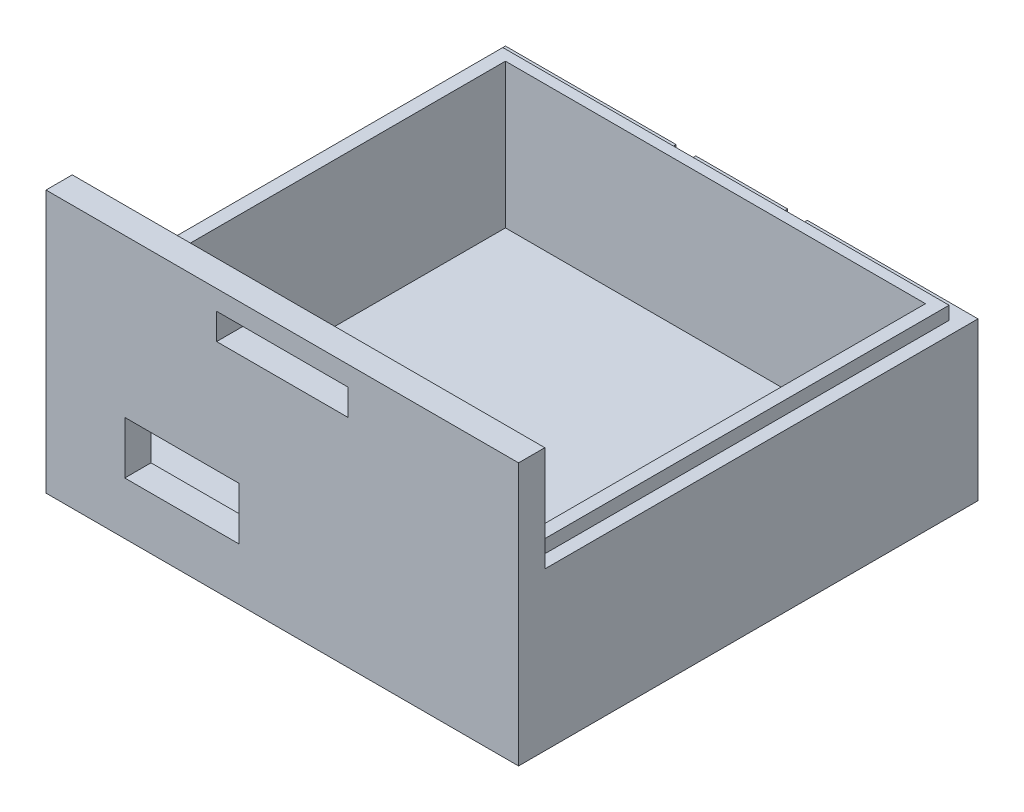
ISO-10303-21;
HEADER;
FILE_DESCRIPTION(('STEP AP214'),'2;1');
FILE_NAME('part.step','',(''),(''),'','','');
FILE_SCHEMA(('AUTOMOTIVE_DESIGN { 1 0 10303 214 1 1 1 1 }'));
ENDSEC;
DATA;
#1=APPLICATION_CONTEXT('core data for automotive mechanical design processes');
#2=APPLICATION_PROTOCOL_DEFINITION('international standard','automotive_design',2000,#1);
#3=PRODUCT_CONTEXT('',#1,'mechanical');
#4=PRODUCT('Part','Part','',(#3));
#5=PRODUCT_RELATED_PRODUCT_CATEGORY('part','',(#4));
#6=PRODUCT_DEFINITION_FORMATION('','',#4);
#7=PRODUCT_DEFINITION_CONTEXT('part definition',#1,'design');
#8=PRODUCT_DEFINITION('design','',#6,#7);
#9=PRODUCT_DEFINITION_SHAPE('','',#8);
#10=(LENGTH_UNIT() NAMED_UNIT(*) SI_UNIT(.MILLI.,.METRE.));
#11=(NAMED_UNIT(*) PLANE_ANGLE_UNIT() SI_UNIT($,.RADIAN.));
#12=(NAMED_UNIT(*) SI_UNIT($,.STERADIAN.) SOLID_ANGLE_UNIT());
#13=UNCERTAINTY_MEASURE_WITH_UNIT(LENGTH_MEASURE(1.E-05),#10,'distance_accuracy_value','');
#14=(GEOMETRIC_REPRESENTATION_CONTEXT(3) GLOBAL_UNCERTAINTY_ASSIGNED_CONTEXT((#13)) GLOBAL_UNIT_ASSIGNED_CONTEXT((#10,
#11,#12)) REPRESENTATION_CONTEXT('',''));
#15=CARTESIAN_POINT('',(0.,0.,0.));
#16=DIRECTION('',(0.,0.,1.));
#17=DIRECTION('',(1.,0.,0.));
#18=AXIS2_PLACEMENT_3D('',#15,#16,#17);
#19=CARTESIAN_POINT('',(-18.,20.,-17.5));
#20=DIRECTION('',(0.,0.,1.));
#21=DIRECTION('',(1.,0.,0.));
#22=AXIS2_PLACEMENT_3D('',#19,#20,#21);
#23=PLANE('',#22);
#24=DIRECTION('',(-1.,0.,0.));
#25=VECTOR('',#24,1.);
#26=CARTESIAN_POINT('',(5.,7.,-17.5));
#27=LINE('',#26,#25);
#28=CARTESIAN_POINT('',(5.,7.,-17.5));
#29=VERTEX_POINT('',#28);
#30=CARTESIAN_POINT('',(-5.,7.,-17.5));
#31=VERTEX_POINT('',#30);
#32=EDGE_CURVE('E532',#29,#31,#27,.T.);
#33=ORIENTED_EDGE('',*,*,#32,.F.);
#34=DIRECTION('',(0.,-1.,0.));
#35=VECTOR('',#34,1.);
#36=CARTESIAN_POINT('',(5.,12.,-17.5));
#37=LINE('',#36,#35);
#38=CARTESIAN_POINT('',(5.,12.,-17.5));
#39=VERTEX_POINT('',#38);
#40=EDGE_CURVE('E259',#39,#29,#37,.T.);
#41=ORIENTED_EDGE('',*,*,#40,.F.);
#42=DIRECTION('',(-1.,0.,0.));
#43=VECTOR('',#42,1.);
#44=CARTESIAN_POINT('',(18.,12.,-17.5));
#45=LINE('',#44,#43);
#46=CARTESIAN_POINT('',(18.,12.,-17.5));
#47=VERTEX_POINT('',#46);
#48=EDGE_CURVE('E322',#47,#39,#45,.T.);
#49=ORIENTED_EDGE('',*,*,#48,.F.);
#50=DIRECTION('',(0.,-1.,0.));
#51=VECTOR('',#50,1.);
#52=CARTESIAN_POINT('',(18.,20.,-17.5));
#53=LINE('',#52,#51);
#54=CARTESIAN_POINT('',(18.,0.,-17.5));
#55=VERTEX_POINT('',#54);
#56=EDGE_CURVE('E11',#47,#55,#53,.T.);
#57=ORIENTED_EDGE('',*,*,#56,.T.);
#58=DIRECTION('',(-1.,0.,0.));
#59=VECTOR('',#58,1.);
#60=CARTESIAN_POINT('',(-18.,0.,-17.5));
#61=LINE('',#60,#59);
#62=CARTESIAN_POINT('',(-18.,0.,-17.5));
#63=VERTEX_POINT('',#62);
#64=EDGE_CURVE('E469',#55,#63,#61,.T.);
#65=ORIENTED_EDGE('',*,*,#64,.T.);
#66=DIRECTION('',(0.,-1.,0.));
#67=VECTOR('',#66,1.);
#68=CARTESIAN_POINT('',(-18.,20.,-17.5));
#69=LINE('',#68,#67);
#70=CARTESIAN_POINT('',(-18.,12.,-17.5));
#71=VERTEX_POINT('',#70);
#72=EDGE_CURVE('E41',#71,#63,#69,.T.);
#73=ORIENTED_EDGE('',*,*,#72,.F.);
#74=CARTESIAN_POINT('',(-5.,12.,-17.5));
#75=VERTEX_POINT('',#74);
#76=EDGE_CURVE('E321',#75,#71,#45,.T.);
#77=ORIENTED_EDGE('',*,*,#76,.F.);
#78=DIRECTION('',(0.,1.,0.));
#79=VECTOR('',#78,1.);
#80=CARTESIAN_POINT('',(-5.,7.,-17.5));
#81=LINE('',#80,#79);
#82=EDGE_CURVE('E529',#31,#75,#81,.T.);
#83=ORIENTED_EDGE('',*,*,#82,.F.);
#84=EDGE_LOOP('',(#33,#41,#49,#57,#65,#73,#77,#83));
#85=FACE_BOUND('',#84,.T.);
#86=ADVANCED_FACE('F33',(#85),#23,.F.);
#87=CARTESIAN_POINT('',(0.,12.,0.));
#88=DIRECTION('',(0.,1.,0.));
#89=DIRECTION('',(0.,0.,1.));
#90=AXIS2_PLACEMENT_3D('',#87,#88,#89);
#91=PLANE('',#90);
#92=DIRECTION('',(0.,0.,-1.));
#93=VECTOR('',#92,1.);
#94=CARTESIAN_POINT('',(-5.,12.,-5.11966011250104));
#95=LINE('',#94,#93);
#96=CARTESIAN_POINT('',(-5.,12.,-16.3));
#97=VERTEX_POINT('',#96);
#98=EDGE_CURVE('E287',#97,#75,#95,.T.);
#99=ORIENTED_EDGE('',*,*,#98,.T.);
#100=ORIENTED_EDGE('',*,*,#76,.T.);
#101=DIRECTION('',(0.,0.,1.));
#102=VECTOR('',#101,1.);
#103=CARTESIAN_POINT('',(-18.,12.,-17.5));
#104=LINE('',#103,#102);
#105=CARTESIAN_POINT('',(-18.,12.,15.5));
#106=VERTEX_POINT('',#105);
#107=EDGE_CURVE('E299',#71,#106,#104,.T.);
#108=ORIENTED_EDGE('',*,*,#107,.T.);
#109=DIRECTION('',(1.,0.,0.));
#110=VECTOR('',#109,1.);
#111=CARTESIAN_POINT('',(-18.,12.,15.5));
#112=LINE('',#111,#110);
#113=CARTESIAN_POINT('',(-17.,12.,15.5));
#114=VERTEX_POINT('',#113);
#115=EDGE_CURVE('E302',#106,#114,#112,.T.);
#116=ORIENTED_EDGE('',*,*,#115,.T.);
#117=DIRECTION('',(0.,0.,-1.));
#118=VECTOR('',#117,1.);
#119=CARTESIAN_POINT('',(-17.,12.,15.5));
#120=LINE('',#119,#118);
#121=CARTESIAN_POINT('',(-17.,12.,-16.3));
#122=VERTEX_POINT('',#121);
#123=EDGE_CURVE('E306',#114,#122,#120,.T.);
#124=ORIENTED_EDGE('',*,*,#123,.T.);
#125=DIRECTION('',(1.,0.,0.));
#126=VECTOR('',#125,1.);
#127=CARTESIAN_POINT('',(-17.,12.,-16.3));
#128=LINE('',#127,#126);
#129=EDGE_CURVE('E309',#122,#97,#128,.T.);
#130=ORIENTED_EDGE('',*,*,#129,.T.);
#131=EDGE_LOOP('',(#99,#100,#108,#116,#124,#130));
#132=FACE_BOUND('',#131,.T.);
#133=ADVANCED_FACE('F511',(#132),#91,.T.);
#134=DIRECTION('',(0.,0.,-1.));
#135=VECTOR('',#134,1.);
#136=CARTESIAN_POINT('',(5.,12.,-5.11966011250104));
#137=LINE('',#136,#135);
#138=CARTESIAN_POINT('',(5.,12.,-16.3));
#139=VERTEX_POINT('',#138);
#140=EDGE_CURVE('E290',#139,#39,#137,.T.);
#141=ORIENTED_EDGE('',*,*,#140,.F.);
#142=CARTESIAN_POINT('',(17.,12.,-16.3));
#143=VERTEX_POINT('',#142);
#144=EDGE_CURVE('E266',#139,#143,#128,.T.);
#145=ORIENTED_EDGE('',*,*,#144,.T.);
#146=DIRECTION('',(0.,0.,1.));
#147=VECTOR('',#146,1.);
#148=CARTESIAN_POINT('',(17.,12.,-16.3));
#149=LINE('',#148,#147);
#150=CARTESIAN_POINT('',(17.,12.,15.5));
#151=VERTEX_POINT('',#150);
#152=EDGE_CURVE('E312',#143,#151,#149,.T.);
#153=ORIENTED_EDGE('',*,*,#152,.T.);
#154=DIRECTION('',(1.,0.,0.));
#155=VECTOR('',#154,1.);
#156=CARTESIAN_POINT('',(17.,12.,15.5));
#157=LINE('',#156,#155);
#158=CARTESIAN_POINT('',(18.,12.,15.5));
#159=VERTEX_POINT('',#158);
#160=EDGE_CURVE('E316',#151,#159,#157,.T.);
#161=ORIENTED_EDGE('',*,*,#160,.T.);
#162=DIRECTION('',(0.,0.,-1.));
#163=VECTOR('',#162,1.);
#164=CARTESIAN_POINT('',(18.,12.,15.5));
#165=LINE('',#164,#163);
#166=EDGE_CURVE('E319',#159,#47,#165,.T.);
#167=ORIENTED_EDGE('',*,*,#166,.T.);
#168=ORIENTED_EDGE('',*,*,#48,.T.);
#169=EDGE_LOOP('',(#141,#145,#153,#161,#167,#168));
#170=FACE_BOUND('',#169,.T.);
#171=ADVANCED_FACE('F552',(#170),#91,.T.);
#172=DIRECTION('',(1.,0.,0.));
#173=VECTOR('',#172,1.);
#174=CARTESIAN_POINT('',(-3.5,9.,-17.5));
#175=LINE('',#174,#173);
#176=CARTESIAN_POINT('',(-3.5,9.,-17.5));
#177=VERTEX_POINT('',#176);
#178=CARTESIAN_POINT('',(3.5,9.,-17.5));
#179=VERTEX_POINT('',#178);
#180=EDGE_CURVE('E268',#177,#179,#175,.T.);
#181=ORIENTED_EDGE('',*,*,#180,.F.);
#182=DIRECTION('',(0.,-1.,0.));
#183=VECTOR('',#182,1.);
#184=CARTESIAN_POINT('',(-3.5,12.,-17.5));
#185=LINE('',#184,#183);
#186=CARTESIAN_POINT('',(-3.5,12.,-17.5));
#187=VERTEX_POINT('',#186);
#188=EDGE_CURVE('E525',#187,#177,#185,.T.);
#189=ORIENTED_EDGE('',*,*,#188,.F.);
#190=CARTESIAN_POINT('',(3.5,12.,-17.5));
#191=VERTEX_POINT('',#190);
#192=EDGE_CURVE('E326',#191,#187,#45,.T.);
#193=ORIENTED_EDGE('',*,*,#192,.F.);
#194=DIRECTION('',(0.,1.,0.));
#195=VECTOR('',#194,1.);
#196=CARTESIAN_POINT('',(3.5,9.,-17.5));
#197=LINE('',#196,#195);
#198=EDGE_CURVE('E48',#179,#191,#197,.T.);
#199=ORIENTED_EDGE('',*,*,#198,.F.);
#200=EDGE_LOOP('',(#181,#189,#193,#199));
#201=FACE_BOUND('',#200,.T.);
#202=ADVANCED_FACE('F523',(#201),#23,.F.);
#203=CARTESIAN_POINT('',(-5.00000000000001,17.5,-17.501));
#204=DIRECTION('',(0.,1.,0.));
#205=DIRECTION('',(0.,0.,1.));
#206=AXIS2_PLACEMENT_3D('',#203,#204,#205);
#207=PLANE('',#206);
#208=DIRECTION('',(1.,0.,0.));
#209=VECTOR('',#208,1.);
#210=CARTESIAN_POINT('',(-4.99999999999999,17.5,16.5));
#211=LINE('',#210,#209);
#212=CARTESIAN_POINT('',(-5.00000000000001,17.5,16.5));
#213=VERTEX_POINT('',#212);
#214=CARTESIAN_POINT('',(4.99999999999999,17.5,16.5));
#215=VERTEX_POINT('',#214);
#216=EDGE_CURVE('E347',#213,#215,#211,.T.);
#217=ORIENTED_EDGE('',*,*,#216,.F.);
#218=DIRECTION('',(0.,0.,1.));
#219=VECTOR('',#218,1.);
#220=CARTESIAN_POINT('',(-5.00000000000001,17.5,-17.501));
#221=LINE('',#220,#219);
#222=CARTESIAN_POINT('',(-5.00000000000001,17.5,15.5));
#223=VERTEX_POINT('',#222);
#224=EDGE_CURVE('E379',#223,#213,#221,.T.);
#225=ORIENTED_EDGE('',*,*,#224,.F.);
#226=DIRECTION('',(1.,0.,0.));
#227=VECTOR('',#226,1.);
#228=CARTESIAN_POINT('',(-5.00000000000001,17.5,15.5));
#229=LINE('',#228,#227);
#230=CARTESIAN_POINT('',(4.99999999999999,17.5,15.5));
#231=VERTEX_POINT('',#230);
#232=EDGE_CURVE('E376',#223,#231,#229,.T.);
#233=ORIENTED_EDGE('',*,*,#232,.T.);
#234=DIRECTION('',(0.,0.,1.));
#235=VECTOR('',#234,1.);
#236=CARTESIAN_POINT('',(4.99999999999999,17.5,-17.501));
#237=LINE('',#236,#235);
#238=EDGE_CURVE('E373',#231,#215,#237,.T.);
#239=ORIENTED_EDGE('',*,*,#238,.T.);
#240=EDGE_LOOP('',(#217,#225,#233,#239));
#241=FACE_BOUND('',#240,.T.);
#242=ADVANCED_FACE('F574',(#241),#207,.F.);
#243=CARTESIAN_POINT('',(18.,20.,17.5));
#244=DIRECTION('',(-1.,0.,0.));
#245=DIRECTION('',(0.,0.,1.));
#246=AXIS2_PLACEMENT_3D('',#243,#244,#245);
#247=PLANE('',#246);
#248=ORIENTED_EDGE('',*,*,#166,.F.);
#249=DIRECTION('',(0.,1.,0.));
#250=VECTOR('',#249,1.);
#251=CARTESIAN_POINT('',(18.,13.,15.5));
#252=LINE('',#251,#250);
#253=CARTESIAN_POINT('',(18.,20.,15.5));
#254=VERTEX_POINT('',#253);
#255=EDGE_CURVE('E453',#159,#254,#252,.T.);
#256=ORIENTED_EDGE('',*,*,#255,.T.);
#257=DIRECTION('',(0.,0.,-1.));
#258=VECTOR('',#257,1.);
#259=CARTESIAN_POINT('',(18.,20.,17.5));
#260=LINE('',#259,#258);
#261=CARTESIAN_POINT('',(18.,20.,17.5));
#262=VERTEX_POINT('',#261);
#263=EDGE_CURVE('E458',#262,#254,#260,.T.);
#264=ORIENTED_EDGE('',*,*,#263,.F.);
#265=DIRECTION('',(0.,-1.,0.));
#266=VECTOR('',#265,1.);
#267=CARTESIAN_POINT('',(18.,20.,17.5));
#268=LINE('',#267,#266);
#269=CARTESIAN_POINT('',(18.,0.,17.5));
#270=VERTEX_POINT('',#269);
#271=EDGE_CURVE('E466',#262,#270,#268,.T.);
#272=ORIENTED_EDGE('',*,*,#271,.T.);
#273=DIRECTION('',(0.,0.,-1.));
#274=VECTOR('',#273,1.);
#275=CARTESIAN_POINT('',(18.,0.,17.5));
#276=LINE('',#275,#274);
#277=EDGE_CURVE('E456',#270,#55,#276,.T.);
#278=ORIENTED_EDGE('',*,*,#277,.T.);
#279=ORIENTED_EDGE('',*,*,#56,.F.);
#280=EDGE_LOOP('',(#248,#256,#264,#272,#278,#279));
#281=FACE_BOUND('',#280,.T.);
#282=ADVANCED_FACE('F35',(#281),#247,.F.);
#283=CARTESIAN_POINT('',(-18.,20.,17.5));
#284=DIRECTION('',(1.,0.,0.));
#285=DIRECTION('',(0.,0.,-1.));
#286=AXIS2_PLACEMENT_3D('',#283,#284,#285);
#287=PLANE('',#286);
#288=DIRECTION('',(0.,1.,0.));
#289=VECTOR('',#288,1.);
#290=CARTESIAN_POINT('',(-18.,13.,15.5));
#291=LINE('',#290,#289);
#292=CARTESIAN_POINT('',(-18.,20.,15.5));
#293=VERTEX_POINT('',#292);
#294=EDGE_CURVE('E450',#106,#293,#291,.T.);
#295=ORIENTED_EDGE('',*,*,#294,.F.);
#296=ORIENTED_EDGE('',*,*,#107,.F.);
#297=ORIENTED_EDGE('',*,*,#72,.T.);
#298=DIRECTION('',(0.,0.,1.));
#299=VECTOR('',#298,1.);
#300=CARTESIAN_POINT('',(-18.,0.,17.5));
#301=LINE('',#300,#299);
#302=CARTESIAN_POINT('',(-18.,0.,17.5));
#303=VERTEX_POINT('',#302);
#304=EDGE_CURVE('E472',#63,#303,#301,.T.);
#305=ORIENTED_EDGE('',*,*,#304,.T.);
#306=DIRECTION('',(0.,-1.,0.));
#307=VECTOR('',#306,1.);
#308=CARTESIAN_POINT('',(-18.,20.,17.5));
#309=LINE('',#308,#307);
#310=CARTESIAN_POINT('',(-18.,20.,17.5));
#311=VERTEX_POINT('',#310);
#312=EDGE_CURVE('E477',#311,#303,#309,.T.);
#313=ORIENTED_EDGE('',*,*,#312,.F.);
#314=DIRECTION('',(0.,0.,1.));
#315=VECTOR('',#314,1.);
#316=CARTESIAN_POINT('',(-18.,20.,17.5));
#317=LINE('',#316,#315);
#318=EDGE_CURVE('E461',#293,#311,#317,.T.);
#319=ORIENTED_EDGE('',*,*,#318,.F.);
#320=EDGE_LOOP('',(#295,#296,#297,#305,#313,#319));
#321=FACE_BOUND('',#320,.T.);
#322=ADVANCED_FACE('F482',(#321),#287,.F.);
#323=CARTESIAN_POINT('',(-18.,20.,17.5));
#324=DIRECTION('',(0.,0.,-1.));
#325=DIRECTION('',(-1.,0.,0.));
#326=AXIS2_PLACEMENT_3D('',#323,#324,#325);
#327=PLANE('',#326);
#328=DIRECTION('',(-1.,0.,0.));
#329=VECTOR('',#328,1.);
#330=CARTESIAN_POINT('',(-4.99999999999999,18.5,17.5));
#331=LINE('',#330,#329);
#332=CARTESIAN_POINT('',(4.99999999999999,18.5,17.5));
#333=VERTEX_POINT('',#332);
#334=CARTESIAN_POINT('',(-4.99999999999999,18.5,17.5));
#335=VERTEX_POINT('',#334);
#336=EDGE_CURVE('E335',#333,#335,#331,.T.);
#337=ORIENTED_EDGE('',*,*,#336,.F.);
#338=DIRECTION('',(0.,1.,0.));
#339=VECTOR('',#338,1.);
#340=CARTESIAN_POINT('',(4.99999999999999,17.5,17.5));
#341=LINE('',#340,#339);
#342=CARTESIAN_POINT('',(4.99999999999999,16.5,17.5));
#343=VERTEX_POINT('',#342);
#344=EDGE_CURVE('E365',#343,#333,#341,.T.);
#345=ORIENTED_EDGE('',*,*,#344,.F.);
#346=DIRECTION('',(1.,0.,0.));
#347=VECTOR('',#346,1.);
#348=CARTESIAN_POINT('',(-5.00000000000001,16.5,17.5));
#349=LINE('',#348,#347);
#350=CARTESIAN_POINT('',(-5.00000000000001,16.5,17.5));
#351=VERTEX_POINT('',#350);
#352=EDGE_CURVE('E370',#351,#343,#349,.T.);
#353=ORIENTED_EDGE('',*,*,#352,.F.);
#354=DIRECTION('',(0.,-1.,0.));
#355=VECTOR('',#354,1.);
#356=CARTESIAN_POINT('',(-5.00000000000001,17.5,17.5));
#357=LINE('',#356,#355);
#358=EDGE_CURVE('E367',#335,#351,#357,.T.);
#359=ORIENTED_EDGE('',*,*,#358,.F.);
#360=EDGE_LOOP('',(#337,#345,#353,#359));
#361=FACE_BOUND('',#360,.T.);
#362=DIRECTION('',(-1.,0.,0.));
#363=VECTOR('',#362,1.);
#364=CARTESIAN_POINT('',(-12.,8.,17.5));
#365=LINE('',#364,#363);
#366=CARTESIAN_POINT('',(-3.3,8.,17.5));
#367=VERTEX_POINT('',#366);
#368=CARTESIAN_POINT('',(-12.,8.,17.5));
#369=VERTEX_POINT('',#368);
#370=EDGE_CURVE('E396',#367,#369,#365,.T.);
#371=ORIENTED_EDGE('',*,*,#370,.F.);
#372=DIRECTION('',(0.,1.,0.));
#373=VECTOR('',#372,1.);
#374=CARTESIAN_POINT('',(-3.3,4.,17.5));
#375=LINE('',#374,#373);
#376=CARTESIAN_POINT('',(-3.3,4.,17.5));
#377=VERTEX_POINT('',#376);
#378=EDGE_CURVE('E394',#377,#367,#375,.T.);
#379=ORIENTED_EDGE('',*,*,#378,.F.);
#380=DIRECTION('',(1.,0.,0.));
#381=VECTOR('',#380,1.);
#382=CARTESIAN_POINT('',(-12.,4.,17.5));
#383=LINE('',#382,#381);
#384=CARTESIAN_POINT('',(-12.,4.,17.5));
#385=VERTEX_POINT('',#384);
#386=EDGE_CURVE('E402',#385,#377,#383,.T.);
#387=ORIENTED_EDGE('',*,*,#386,.F.);
#388=DIRECTION('',(0.,-1.,0.));
#389=VECTOR('',#388,1.);
#390=CARTESIAN_POINT('',(-12.,4.,17.5));
#391=LINE('',#390,#389);
#392=EDGE_CURVE('E399',#369,#385,#391,.T.);
#393=ORIENTED_EDGE('',*,*,#392,.F.);
#394=EDGE_LOOP('',(#371,#379,#387,#393));
#395=FACE_BOUND('',#394,.T.);
#396=DIRECTION('',(1.,0.,0.));
#397=VECTOR('',#396,1.);
#398=CARTESIAN_POINT('',(-18.,0.,17.5));
#399=LINE('',#398,#397);
#400=EDGE_CURVE('E462',#303,#270,#399,.T.);
#401=ORIENTED_EDGE('',*,*,#400,.T.);
#402=ORIENTED_EDGE('',*,*,#271,.F.);
#403=DIRECTION('',(1.,0.,0.));
#404=VECTOR('',#403,1.);
#405=CARTESIAN_POINT('',(-18.,20.,17.5));
#406=LINE('',#405,#404);
#407=EDGE_CURVE('E464',#311,#262,#406,.T.);
#408=ORIENTED_EDGE('',*,*,#407,.F.);
#409=ORIENTED_EDGE('',*,*,#312,.T.);
#410=EDGE_LOOP('',(#401,#402,#408,#409));
#411=FACE_BOUND('',#410,.T.);
#412=ADVANCED_FACE('F496',(#361,#395,#411),#327,.F.);
#413=CARTESIAN_POINT('',(0.,20.,0.));
#414=DIRECTION('',(0.,-1.,0.));
#415=DIRECTION('',(0.,0.,-1.));
#416=AXIS2_PLACEMENT_3D('',#413,#414,#415);
#417=PLANE('',#416);
#418=ORIENTED_EDGE('',*,*,#263,.T.);
#419=DIRECTION('',(1.,0.,0.));
#420=VECTOR('',#419,1.);
#421=CARTESIAN_POINT('',(-18.,20.,15.5));
#422=LINE('',#421,#420);
#423=EDGE_CURVE('E441',#293,#254,#422,.T.);
#424=ORIENTED_EDGE('',*,*,#423,.F.);
#425=ORIENTED_EDGE('',*,*,#318,.T.);
#426=ORIENTED_EDGE('',*,*,#407,.T.);
#427=EDGE_LOOP('',(#418,#424,#425,#426));
#428=FACE_BOUND('',#427,.T.);
#429=ADVANCED_FACE('F503',(#428),#417,.F.);
#430=CARTESIAN_POINT('',(0.,0.,0.));
#431=DIRECTION('',(0.,-1.,0.));
#432=DIRECTION('',(0.,0.,-1.));
#433=AXIS2_PLACEMENT_3D('',#430,#431,#432);
#434=PLANE('',#433);
#435=ORIENTED_EDGE('',*,*,#277,.F.);
#436=ORIENTED_EDGE('',*,*,#400,.F.);
#437=ORIENTED_EDGE('',*,*,#304,.F.);
#438=ORIENTED_EDGE('',*,*,#64,.F.);
#439=EDGE_LOOP('',(#435,#436,#437,#438));
#440=FACE_BOUND('',#439,.T.);
#441=ADVANCED_FACE('F493',(#440),#434,.T.);
#442=CARTESIAN_POINT('',(-18.,13.,15.5));
#443=DIRECTION('',(0.,0.,1.));
#444=DIRECTION('',(1.,0.,0.));
#445=AXIS2_PLACEMENT_3D('',#442,#443,#444);
#446=PLANE('',#445);
#447=DIRECTION('',(-1.,0.,0.));
#448=VECTOR('',#447,1.);
#449=CARTESIAN_POINT('',(-5.00000000000001,16.5,15.5));
#450=LINE('',#449,#448);
#451=CARTESIAN_POINT('',(4.99999999999999,16.5,15.5));
#452=VERTEX_POINT('',#451);
#453=CARTESIAN_POINT('',(-5.00000000000001,16.5,15.5));
#454=VERTEX_POINT('',#453);
#455=EDGE_CURVE('E359',#452,#454,#450,.T.);
#456=ORIENTED_EDGE('',*,*,#455,.F.);
#457=DIRECTION('',(0.,-1.,0.));
#458=VECTOR('',#457,1.);
#459=CARTESIAN_POINT('',(4.99999999999999,17.5,15.5));
#460=LINE('',#459,#458);
#461=EDGE_CURVE('E362',#231,#452,#460,.T.);
#462=ORIENTED_EDGE('',*,*,#461,.F.);
#463=ORIENTED_EDGE('',*,*,#232,.F.);
#464=DIRECTION('',(0.,1.,0.));
#465=VECTOR('',#464,1.);
#466=CARTESIAN_POINT('',(-5.00000000000001,17.5,15.5));
#467=LINE('',#466,#465);
#468=EDGE_CURVE('E355',#454,#223,#467,.T.);
#469=ORIENTED_EDGE('',*,*,#468,.F.);
#470=EDGE_LOOP('',(#456,#462,#463,#469));
#471=FACE_BOUND('',#470,.T.);
#472=DIRECTION('',(-1.,0.,0.));
#473=VECTOR('',#472,1.);
#474=CARTESIAN_POINT('',(-12.,4.,15.5));
#475=LINE('',#474,#473);
#476=CARTESIAN_POINT('',(-3.3,4.,15.5));
#477=VERTEX_POINT('',#476);
#478=CARTESIAN_POINT('',(-12.,4.,15.5));
#479=VERTEX_POINT('',#478);
#480=EDGE_CURVE('E388',#477,#479,#475,.T.);
#481=ORIENTED_EDGE('',*,*,#480,.F.);
#482=DIRECTION('',(0.,-1.,0.));
#483=VECTOR('',#482,1.);
#484=CARTESIAN_POINT('',(-3.3,4.,15.5));
#485=LINE('',#484,#483);
#486=CARTESIAN_POINT('',(-3.3,8.,15.5));
#487=VERTEX_POINT('',#486);
#488=EDGE_CURVE('E391',#487,#477,#485,.T.);
#489=ORIENTED_EDGE('',*,*,#488,.F.);
#490=DIRECTION('',(1.,0.,0.));
#491=VECTOR('',#490,1.);
#492=CARTESIAN_POINT('',(-12.,8.,15.5));
#493=LINE('',#492,#491);
#494=CARTESIAN_POINT('',(-12.,8.,15.5));
#495=VERTEX_POINT('',#494);
#496=EDGE_CURVE('E408',#495,#487,#493,.T.);
#497=ORIENTED_EDGE('',*,*,#496,.F.);
#498=DIRECTION('',(0.,1.,0.));
#499=VECTOR('',#498,1.);
#500=CARTESIAN_POINT('',(-12.,4.,15.5));
#501=LINE('',#500,#499);
#502=EDGE_CURVE('E386',#479,#495,#501,.T.);
#503=ORIENTED_EDGE('',*,*,#502,.F.);
#504=EDGE_LOOP('',(#481,#489,#497,#503));
#505=FACE_BOUND('',#504,.T.);
#506=ORIENTED_EDGE('',*,*,#423,.T.);
#507=ORIENTED_EDGE('',*,*,#255,.F.);
#508=ORIENTED_EDGE('',*,*,#160,.F.);
#509=DIRECTION('',(0.,1.,0.));
#510=VECTOR('',#509,1.);
#511=CARTESIAN_POINT('',(17.,12.,15.5));
#512=LINE('',#511,#510);
#513=CARTESIAN_POINT('',(17.,13.,15.5));
#514=VERTEX_POINT('',#513);
#515=EDGE_CURVE('E333',#151,#514,#512,.T.);
#516=ORIENTED_EDGE('',*,*,#515,.T.);
#517=DIRECTION('',(1.,0.,0.));
#518=VECTOR('',#517,1.);
#519=CARTESIAN_POINT('',(-18.,13.,15.5));
#520=LINE('',#519,#518);
#521=CARTESIAN_POINT('',(16.,13.,15.5));
#522=VERTEX_POINT('',#521);
#523=EDGE_CURVE('E451',#522,#514,#520,.T.);
#524=ORIENTED_EDGE('',*,*,#523,.F.);
#525=DIRECTION('',(0.,1.,0.));
#526=VECTOR('',#525,1.);
#527=CARTESIAN_POINT('',(16.,2.,15.5));
#528=LINE('',#527,#526);
#529=CARTESIAN_POINT('',(16.,2.,15.5));
#530=VERTEX_POINT('',#529);
#531=EDGE_CURVE('E444',#530,#522,#528,.T.);
#532=ORIENTED_EDGE('',*,*,#531,.F.);
#533=DIRECTION('',(1.,0.,0.));
#534=VECTOR('',#533,1.);
#535=CARTESIAN_POINT('',(-16.,2.,15.5));
#536=LINE('',#535,#534);
#537=CARTESIAN_POINT('',(-16.,2.,15.5));
#538=VERTEX_POINT('',#537);
#539=EDGE_CURVE('E421',#538,#530,#536,.T.);
#540=ORIENTED_EDGE('',*,*,#539,.F.);
#541=DIRECTION('',(0.,1.,0.));
#542=VECTOR('',#541,1.);
#543=CARTESIAN_POINT('',(-16.,2.,15.5));
#544=LINE('',#543,#542);
#545=CARTESIAN_POINT('',(-16.,13.,15.5));
#546=VERTEX_POINT('',#545);
#547=EDGE_CURVE('E431',#538,#546,#544,.T.);
#548=ORIENTED_EDGE('',*,*,#547,.T.);
#549=CARTESIAN_POINT('',(-17.,13.,15.5));
#550=VERTEX_POINT('',#549);
#551=EDGE_CURVE('E448',#550,#546,#520,.T.);
#552=ORIENTED_EDGE('',*,*,#551,.F.);
#553=DIRECTION('',(0.,1.,0.));
#554=VECTOR('',#553,1.);
#555=CARTESIAN_POINT('',(-17.,12.,15.5));
#556=LINE('',#555,#554);
#557=EDGE_CURVE('E325',#114,#550,#556,.T.);
#558=ORIENTED_EDGE('',*,*,#557,.F.);
#559=ORIENTED_EDGE('',*,*,#115,.F.);
#560=ORIENTED_EDGE('',*,*,#294,.T.);
#561=EDGE_LOOP('',(#506,#507,#508,#516,#524,#532,#540,#548,#552,#558,#559,#560));
#562=FACE_BOUND('',#561,.T.);
#563=ADVANCED_FACE('F507',(#471,#505,#562),#446,.F.);
#564=CARTESIAN_POINT('',(0.,13.,0.));
#565=DIRECTION('',(0.,1.,0.));
#566=DIRECTION('',(0.,0.,1.));
#567=AXIS2_PLACEMENT_3D('',#564,#565,#566);
#568=PLANE('',#567);
#569=DIRECTION('',(0.,0.,1.));
#570=VECTOR('',#569,1.);
#571=CARTESIAN_POINT('',(17.,13.,-16.3));
#572=LINE('',#571,#570);
#573=CARTESIAN_POINT('',(17.,13.,-16.3));
#574=VERTEX_POINT('',#573);
#575=EDGE_CURVE('E303',#574,#514,#572,.T.);
#576=ORIENTED_EDGE('',*,*,#575,.F.);
#577=DIRECTION('',(1.,0.,0.));
#578=VECTOR('',#577,1.);
#579=CARTESIAN_POINT('',(-17.,13.,-16.3));
#580=LINE('',#579,#578);
#581=CARTESIAN_POINT('',(-17.,13.,-16.3));
#582=VERTEX_POINT('',#581);
#583=EDGE_CURVE('E329',#582,#574,#580,.T.);
#584=ORIENTED_EDGE('',*,*,#583,.F.);
#585=DIRECTION('',(0.,0.,-1.));
#586=VECTOR('',#585,1.);
#587=CARTESIAN_POINT('',(-17.,13.,15.5));
#588=LINE('',#587,#586);
#589=EDGE_CURVE('E298',#550,#582,#588,.T.);
#590=ORIENTED_EDGE('',*,*,#589,.F.);
#591=ORIENTED_EDGE('',*,*,#551,.T.);
#592=DIRECTION('',(0.,0.,1.));
#593=VECTOR('',#592,1.);
#594=CARTESIAN_POINT('',(-16.,13.,-15.5));
#595=LINE('',#594,#593);
#596=CARTESIAN_POINT('',(-16.,13.,-15.5));
#597=VERTEX_POINT('',#596);
#598=EDGE_CURVE('E417',#597,#546,#595,.T.);
#599=ORIENTED_EDGE('',*,*,#598,.F.);
#600=DIRECTION('',(-1.,0.,0.));
#601=VECTOR('',#600,1.);
#602=CARTESIAN_POINT('',(16.,13.,-15.5));
#603=LINE('',#602,#601);
#604=CARTESIAN_POINT('',(16.,13.,-15.5));
#605=VERTEX_POINT('',#604);
#606=EDGE_CURVE('E422',#605,#597,#603,.T.);
#607=ORIENTED_EDGE('',*,*,#606,.F.);
#608=DIRECTION('',(0.,0.,-1.));
#609=VECTOR('',#608,1.);
#610=CARTESIAN_POINT('',(16.,13.,15.5));
#611=LINE('',#610,#609);
#612=EDGE_CURVE('E434',#522,#605,#611,.T.);
#613=ORIENTED_EDGE('',*,*,#612,.F.);
#614=ORIENTED_EDGE('',*,*,#523,.T.);
#615=EDGE_LOOP('',(#576,#584,#590,#591,#599,#607,#613,#614));
#616=FACE_BOUND('',#615,.T.);
#617=ADVANCED_FACE('F545',(#616),#568,.T.);
#618=CARTESIAN_POINT('',(-16.,2.,-15.5));
#619=DIRECTION('',(-1.,0.,0.));
#620=DIRECTION('',(0.,0.,1.));
#621=AXIS2_PLACEMENT_3D('',#618,#619,#620);
#622=PLANE('',#621);
#623=ORIENTED_EDGE('',*,*,#598,.T.);
#624=ORIENTED_EDGE('',*,*,#547,.F.);
#625=DIRECTION('',(0.,0.,1.));
#626=VECTOR('',#625,1.);
#627=CARTESIAN_POINT('',(-16.,2.,-15.5));
#628=LINE('',#627,#626);
#629=CARTESIAN_POINT('',(-16.,2.,-15.5));
#630=VERTEX_POINT('',#629);
#631=EDGE_CURVE('E418',#630,#538,#628,.T.);
#632=ORIENTED_EDGE('',*,*,#631,.F.);
#633=DIRECTION('',(0.,1.,0.));
#634=VECTOR('',#633,1.);
#635=CARTESIAN_POINT('',(-16.,2.,-15.5));
#636=LINE('',#635,#634);
#637=EDGE_CURVE('E439',#630,#597,#636,.T.);
#638=ORIENTED_EDGE('',*,*,#637,.T.);
#639=EDGE_LOOP('',(#623,#624,#632,#638));
#640=FACE_BOUND('',#639,.T.);
#641=ADVANCED_FACE('F639',(#640),#622,.F.);
#642=CARTESIAN_POINT('',(16.,2.,-15.5));
#643=DIRECTION('',(0.,0.,-1.));
#644=DIRECTION('',(-1.,0.,0.));
#645=AXIS2_PLACEMENT_3D('',#642,#643,#644);
#646=PLANE('',#645);
#647=ORIENTED_EDGE('',*,*,#606,.T.);
#648=ORIENTED_EDGE('',*,*,#637,.F.);
#649=DIRECTION('',(-1.,0.,0.));
#650=VECTOR('',#649,1.);
#651=CARTESIAN_POINT('',(16.,2.,-15.5));
#652=LINE('',#651,#650);
#653=CARTESIAN_POINT('',(16.,2.,-15.5));
#654=VERTEX_POINT('',#653);
#655=EDGE_CURVE('E428',#654,#630,#652,.T.);
#656=ORIENTED_EDGE('',*,*,#655,.F.);
#657=DIRECTION('',(0.,1.,0.));
#658=VECTOR('',#657,1.);
#659=CARTESIAN_POINT('',(16.,2.,-15.5));
#660=LINE('',#659,#658);
#661=EDGE_CURVE('E442',#654,#605,#660,.T.);
#662=ORIENTED_EDGE('',*,*,#661,.T.);
#663=EDGE_LOOP('',(#647,#648,#656,#662));
#664=FACE_BOUND('',#663,.T.);
#665=ADVANCED_FACE('F636',(#664),#646,.F.);
#666=CARTESIAN_POINT('',(16.,2.,15.5));
#667=DIRECTION('',(1.,0.,0.));
#668=DIRECTION('',(0.,0.,-1.));
#669=AXIS2_PLACEMENT_3D('',#666,#667,#668);
#670=PLANE('',#669);
#671=ORIENTED_EDGE('',*,*,#612,.T.);
#672=ORIENTED_EDGE('',*,*,#661,.F.);
#673=DIRECTION('',(0.,0.,-1.));
#674=VECTOR('',#673,1.);
#675=CARTESIAN_POINT('',(16.,2.,15.5));
#676=LINE('',#675,#674);
#677=EDGE_CURVE('E425',#530,#654,#676,.T.);
#678=ORIENTED_EDGE('',*,*,#677,.F.);
#679=ORIENTED_EDGE('',*,*,#531,.T.);
#680=EDGE_LOOP('',(#671,#672,#678,#679));
#681=FACE_BOUND('',#680,.T.);
#682=ADVANCED_FACE('F634',(#681),#670,.F.);
#683=CARTESIAN_POINT('',(0.,2.,0.));
#684=DIRECTION('',(0.,1.,0.));
#685=DIRECTION('',(0.,0.,1.));
#686=AXIS2_PLACEMENT_3D('',#683,#684,#685);
#687=PLANE('',#686);
#688=ORIENTED_EDGE('',*,*,#631,.T.);
#689=ORIENTED_EDGE('',*,*,#539,.T.);
#690=ORIENTED_EDGE('',*,*,#677,.T.);
#691=ORIENTED_EDGE('',*,*,#655,.T.);
#692=EDGE_LOOP('',(#688,#689,#690,#691));
#693=FACE_BOUND('',#692,.T.);
#694=ADVANCED_FACE('F630',(#693),#687,.T.);
#695=CARTESIAN_POINT('',(-3.3,4.,-17.501));
#696=DIRECTION('',(1.,0.,0.));
#697=DIRECTION('',(0.,0.,-1.));
#698=AXIS2_PLACEMENT_3D('',#695,#696,#697);
#699=PLANE('',#698);
#700=ORIENTED_EDGE('',*,*,#488,.T.);
#701=DIRECTION('',(0.,0.,1.));
#702=VECTOR('',#701,1.);
#703=CARTESIAN_POINT('',(-3.3,4.,-17.501));
#704=LINE('',#703,#702);
#705=EDGE_CURVE('E406',#477,#377,#704,.T.);
#706=ORIENTED_EDGE('',*,*,#705,.T.);
#707=ORIENTED_EDGE('',*,*,#378,.T.);
#708=DIRECTION('',(0.,0.,1.));
#709=VECTOR('',#708,1.);
#710=CARTESIAN_POINT('',(-3.3,8.,-17.501));
#711=LINE('',#710,#709);
#712=EDGE_CURVE('E405',#487,#367,#711,.T.);
#713=ORIENTED_EDGE('',*,*,#712,.F.);
#714=EDGE_LOOP('',(#700,#706,#707,#713));
#715=FACE_BOUND('',#714,.T.);
#716=ADVANCED_FACE('F620',(#715),#699,.F.);
#717=CARTESIAN_POINT('',(-12.,4.,-17.501));
#718=DIRECTION('',(0.,-1.,0.));
#719=DIRECTION('',(0.,0.,-1.));
#720=AXIS2_PLACEMENT_3D('',#717,#718,#719);
#721=PLANE('',#720);
#722=ORIENTED_EDGE('',*,*,#480,.T.);
#723=DIRECTION('',(0.,0.,1.));
#724=VECTOR('',#723,1.);
#725=CARTESIAN_POINT('',(-12.,4.,-17.501));
#726=LINE('',#725,#724);
#727=EDGE_CURVE('E409',#479,#385,#726,.T.);
#728=ORIENTED_EDGE('',*,*,#727,.T.);
#729=ORIENTED_EDGE('',*,*,#386,.T.);
#730=ORIENTED_EDGE('',*,*,#705,.F.);
#731=EDGE_LOOP('',(#722,#728,#729,#730));
#732=FACE_BOUND('',#731,.T.);
#733=ADVANCED_FACE('F616',(#732),#721,.F.);
#734=CARTESIAN_POINT('',(-12.,4.,-17.501));
#735=DIRECTION('',(-1.,0.,0.));
#736=DIRECTION('',(0.,0.,1.));
#737=AXIS2_PLACEMENT_3D('',#734,#735,#736);
#738=PLANE('',#737);
#739=ORIENTED_EDGE('',*,*,#502,.T.);
#740=DIRECTION('',(0.,0.,1.));
#741=VECTOR('',#740,1.);
#742=CARTESIAN_POINT('',(-12.,8.,-17.501));
#743=LINE('',#742,#741);
#744=EDGE_CURVE('E411',#495,#369,#743,.T.);
#745=ORIENTED_EDGE('',*,*,#744,.T.);
#746=ORIENTED_EDGE('',*,*,#392,.T.);
#747=ORIENTED_EDGE('',*,*,#727,.F.);
#748=EDGE_LOOP('',(#739,#745,#746,#747));
#749=FACE_BOUND('',#748,.T.);
#750=ADVANCED_FACE('F619',(#749),#738,.F.);
#751=CARTESIAN_POINT('',(-12.,8.,-17.501));
#752=DIRECTION('',(0.,1.,0.));
#753=DIRECTION('',(0.,0.,1.));
#754=AXIS2_PLACEMENT_3D('',#751,#752,#753);
#755=PLANE('',#754);
#756=ORIENTED_EDGE('',*,*,#496,.T.);
#757=ORIENTED_EDGE('',*,*,#712,.T.);
#758=ORIENTED_EDGE('',*,*,#370,.T.);
#759=ORIENTED_EDGE('',*,*,#744,.F.);
#760=EDGE_LOOP('',(#756,#757,#758,#759));
#761=FACE_BOUND('',#760,.T.);
#762=ADVANCED_FACE('F614',(#761),#755,.F.);
#763=CARTESIAN_POINT('',(4.99999999999999,17.5,-17.501));
#764=DIRECTION('',(1.,0.,0.));
#765=DIRECTION('',(0.,0.,-1.));
#766=AXIS2_PLACEMENT_3D('',#763,#764,#765);
#767=PLANE('',#766);
#768=ORIENTED_EDGE('',*,*,#461,.T.);
#769=DIRECTION('',(0.,0.,1.));
#770=VECTOR('',#769,1.);
#771=CARTESIAN_POINT('',(4.99999999999999,16.5,-17.501));
#772=LINE('',#771,#770);
#773=EDGE_CURVE('E374',#452,#343,#772,.T.);
#774=ORIENTED_EDGE('',*,*,#773,.T.);
#775=ORIENTED_EDGE('',*,*,#344,.T.);
#776=DIRECTION('',(0.,0.,1.));
#777=VECTOR('',#776,1.);
#778=CARTESIAN_POINT('',(4.99999999999999,18.5,16.5));
#779=LINE('',#778,#777);
#780=CARTESIAN_POINT('',(4.99999999999999,18.5,16.5));
#781=VERTEX_POINT('',#780);
#782=EDGE_CURVE('E349',#781,#333,#779,.T.);
#783=ORIENTED_EDGE('',*,*,#782,.F.);
#784=DIRECTION('',(0.,1.,0.));
#785=VECTOR('',#784,1.);
#786=CARTESIAN_POINT('',(4.99999999999999,18.5,16.5));
#787=LINE('',#786,#785);
#788=EDGE_CURVE('E341',#215,#781,#787,.T.);
#789=ORIENTED_EDGE('',*,*,#788,.F.);
#790=ORIENTED_EDGE('',*,*,#238,.F.);
#791=EDGE_LOOP('',(#768,#774,#775,#783,#789,#790));
#792=FACE_BOUND('',#791,.T.);
#793=ADVANCED_FACE('F607',(#792),#767,.F.);
#794=CARTESIAN_POINT('',(-5.00000000000001,16.5,-17.501));
#795=DIRECTION('',(0.,-1.,0.));
#796=DIRECTION('',(0.,0.,-1.));
#797=AXIS2_PLACEMENT_3D('',#794,#795,#796);
#798=PLANE('',#797);
#799=ORIENTED_EDGE('',*,*,#455,.T.);
#800=DIRECTION('',(0.,0.,1.));
#801=VECTOR('',#800,1.);
#802=CARTESIAN_POINT('',(-5.00000000000001,16.5,-17.501));
#803=LINE('',#802,#801);
#804=EDGE_CURVE('E377',#454,#351,#803,.T.);
#805=ORIENTED_EDGE('',*,*,#804,.T.);
#806=ORIENTED_EDGE('',*,*,#352,.T.);
#807=ORIENTED_EDGE('',*,*,#773,.F.);
#808=EDGE_LOOP('',(#799,#805,#806,#807));
#809=FACE_BOUND('',#808,.T.);
#810=ADVANCED_FACE('F604',(#809),#798,.F.);
#811=CARTESIAN_POINT('',(-5.00000000000001,17.5,-17.501));
#812=DIRECTION('',(-1.,0.,0.));
#813=DIRECTION('',(0.,-1.,0.));
#814=AXIS2_PLACEMENT_3D('',#811,#812,#813);
#815=PLANE('',#814);
#816=ORIENTED_EDGE('',*,*,#468,.T.);
#817=ORIENTED_EDGE('',*,*,#224,.T.);
#818=DIRECTION('',(0.,-1.,0.));
#819=VECTOR('',#818,1.);
#820=CARTESIAN_POINT('',(-4.99999999999999,18.5,16.5));
#821=LINE('',#820,#819);
#822=CARTESIAN_POINT('',(-4.99999999999999,18.5,16.5));
#823=VERTEX_POINT('',#822);
#824=EDGE_CURVE('E56',#823,#213,#821,.T.);
#825=ORIENTED_EDGE('',*,*,#824,.F.);
#826=DIRECTION('',(0.,0.,1.));
#827=VECTOR('',#826,1.);
#828=CARTESIAN_POINT('',(-4.99999999999999,18.5,16.5));
#829=LINE('',#828,#827);
#830=EDGE_CURVE('E352',#823,#335,#829,.T.);
#831=ORIENTED_EDGE('',*,*,#830,.T.);
#832=ORIENTED_EDGE('',*,*,#358,.T.);
#833=ORIENTED_EDGE('',*,*,#804,.F.);
#834=EDGE_LOOP('',(#816,#817,#825,#831,#832,#833));
#835=FACE_BOUND('',#834,.T.);
#836=ADVANCED_FACE('F602',(#835),#815,.F.);
#837=CARTESIAN_POINT('',(-4.99999999999999,18.5,16.5));
#838=DIRECTION('',(0.,1.,0.));
#839=DIRECTION('',(0.,0.,1.));
#840=AXIS2_PLACEMENT_3D('',#837,#838,#839);
#841=PLANE('',#840);
#842=ORIENTED_EDGE('',*,*,#336,.T.);
#843=ORIENTED_EDGE('',*,*,#830,.F.);
#844=DIRECTION('',(-1.,0.,0.));
#845=VECTOR('',#844,1.);
#846=CARTESIAN_POINT('',(-4.99999999999999,18.5,16.5));
#847=LINE('',#846,#845);
#848=EDGE_CURVE('E344',#781,#823,#847,.T.);
#849=ORIENTED_EDGE('',*,*,#848,.F.);
#850=ORIENTED_EDGE('',*,*,#782,.T.);
#851=EDGE_LOOP('',(#842,#843,#849,#850));
#852=FACE_BOUND('',#851,.T.);
#853=ADVANCED_FACE('F599',(#852),#841,.F.);
#854=CARTESIAN_POINT('',(0.,0.,16.5));
#855=DIRECTION('',(0.,0.,1.));
#856=DIRECTION('',(1.,0.,0.));
#857=AXIS2_PLACEMENT_3D('',#854,#855,#856);
#858=PLANE('',#857);
#859=ORIENTED_EDGE('',*,*,#788,.T.);
#860=ORIENTED_EDGE('',*,*,#848,.T.);
#861=ORIENTED_EDGE('',*,*,#824,.T.);
#862=ORIENTED_EDGE('',*,*,#216,.T.);
#863=EDGE_LOOP('',(#859,#860,#861,#862));
#864=FACE_BOUND('',#863,.T.);
#865=ADVANCED_FACE('F596',(#864),#858,.T.);
#866=CARTESIAN_POINT('',(17.,12.,-16.3));
#867=DIRECTION('',(-1.,0.,0.));
#868=DIRECTION('',(0.,0.,1.));
#869=AXIS2_PLACEMENT_3D('',#866,#867,#868);
#870=PLANE('',#869);
#871=ORIENTED_EDGE('',*,*,#575,.T.);
#872=ORIENTED_EDGE('',*,*,#515,.F.);
#873=ORIENTED_EDGE('',*,*,#152,.F.);
#874=DIRECTION('',(0.,1.,0.));
#875=VECTOR('',#874,1.);
#876=CARTESIAN_POINT('',(17.,12.,-16.3));
#877=LINE('',#876,#875);
#878=EDGE_CURVE('E336',#143,#574,#877,.T.);
#879=ORIENTED_EDGE('',*,*,#878,.T.);
#880=EDGE_LOOP('',(#871,#872,#873,#879));
#881=FACE_BOUND('',#880,.T.);
#882=ADVANCED_FACE('F549',(#881),#870,.F.);
#883=CARTESIAN_POINT('',(-17.,12.,-16.3));
#884=DIRECTION('',(0.,0.,1.));
#885=DIRECTION('',(1.,0.,0.));
#886=AXIS2_PLACEMENT_3D('',#883,#884,#885);
#887=PLANE('',#886);
#888=CARTESIAN_POINT('',(-3.5,12.,-16.3));
#889=VERTEX_POINT('',#888);
#890=CARTESIAN_POINT('',(3.5,12.,-16.3));
#891=VERTEX_POINT('',#890);
#892=EDGE_CURVE('E313',#889,#891,#128,.T.);
#893=ORIENTED_EDGE('',*,*,#892,.F.);
#894=DIRECTION('',(0.,-1.,0.));
#895=VECTOR('',#894,1.);
#896=CARTESIAN_POINT('',(-3.5,12.,-16.3));
#897=LINE('',#896,#895);
#898=CARTESIAN_POINT('',(-3.5,9.,-16.3));
#899=VERTEX_POINT('',#898);
#900=EDGE_CURVE('E282',#889,#899,#897,.T.);
#901=ORIENTED_EDGE('',*,*,#900,.T.);
#902=DIRECTION('',(1.,0.,0.));
#903=VECTOR('',#902,1.);
#904=CARTESIAN_POINT('',(-3.5,9.,-16.3));
#905=LINE('',#904,#903);
#906=CARTESIAN_POINT('',(3.5,9.,-16.3));
#907=VERTEX_POINT('',#906);
#908=EDGE_CURVE('E278',#899,#907,#905,.T.);
#909=ORIENTED_EDGE('',*,*,#908,.T.);
#910=DIRECTION('',(0.,1.,0.));
#911=VECTOR('',#910,1.);
#912=CARTESIAN_POINT('',(3.5,9.,-16.3));
#913=LINE('',#912,#911);
#914=EDGE_CURVE('E273',#907,#891,#913,.T.);
#915=ORIENTED_EDGE('',*,*,#914,.T.);
#916=EDGE_LOOP('',(#893,#901,#909,#915));
#917=FACE_BOUND('',#916,.T.);
#918=ORIENTED_EDGE('',*,*,#583,.T.);
#919=ORIENTED_EDGE('',*,*,#878,.F.);
#920=ORIENTED_EDGE('',*,*,#144,.F.);
#921=DIRECTION('',(0.,-1.,0.));
#922=VECTOR('',#921,1.);
#923=CARTESIAN_POINT('',(5.,12.,-16.3));
#924=LINE('',#923,#922);
#925=CARTESIAN_POINT('',(5.,7.,-16.3));
#926=VERTEX_POINT('',#925);
#927=EDGE_CURVE('E256',#139,#926,#924,.T.);
#928=ORIENTED_EDGE('',*,*,#927,.T.);
#929=DIRECTION('',(-1.,0.,0.));
#930=VECTOR('',#929,1.);
#931=CARTESIAN_POINT('',(5.,7.,-16.3));
#932=LINE('',#931,#930);
#933=CARTESIAN_POINT('',(-5.,7.,-16.3));
#934=VERTEX_POINT('',#933);
#935=EDGE_CURVE('E243',#926,#934,#932,.T.);
#936=ORIENTED_EDGE('',*,*,#935,.T.);
#937=DIRECTION('',(0.,1.,0.));
#938=VECTOR('',#937,1.);
#939=CARTESIAN_POINT('',(-5.,7.,-16.3));
#940=LINE('',#939,#938);
#941=EDGE_CURVE('E286',#934,#97,#940,.T.);
#942=ORIENTED_EDGE('',*,*,#941,.T.);
#943=ORIENTED_EDGE('',*,*,#129,.F.);
#944=DIRECTION('',(0.,1.,0.));
#945=VECTOR('',#944,1.);
#946=CARTESIAN_POINT('',(-17.,12.,-16.3));
#947=LINE('',#946,#945);
#948=EDGE_CURVE('E338',#122,#582,#947,.T.);
#949=ORIENTED_EDGE('',*,*,#948,.T.);
#950=EDGE_LOOP('',(#918,#919,#920,#928,#936,#942,#943,#949));
#951=FACE_BOUND('',#950,.T.);
#952=ADVANCED_FACE('F264',(#917,#951),#887,.F.);
#953=CARTESIAN_POINT('',(-17.,12.,15.5));
#954=DIRECTION('',(1.,0.,0.));
#955=DIRECTION('',(0.,0.,-1.));
#956=AXIS2_PLACEMENT_3D('',#953,#954,#955);
#957=PLANE('',#956);
#958=ORIENTED_EDGE('',*,*,#589,.T.);
#959=ORIENTED_EDGE('',*,*,#948,.F.);
#960=ORIENTED_EDGE('',*,*,#123,.F.);
#961=ORIENTED_EDGE('',*,*,#557,.T.);
#962=EDGE_LOOP('',(#958,#959,#960,#961));
#963=FACE_BOUND('',#962,.T.);
#964=ADVANCED_FACE('F538',(#963),#957,.F.);
#965=DIRECTION('',(0.,0.,-1.));
#966=VECTOR('',#965,1.);
#967=CARTESIAN_POINT('',(-3.5,12.,-5.11966011250104));
#968=LINE('',#967,#966);
#969=EDGE_CURVE('E285',#889,#187,#968,.T.);
#970=ORIENTED_EDGE('',*,*,#969,.F.);
#971=ORIENTED_EDGE('',*,*,#892,.T.);
#972=DIRECTION('',(0.,0.,-1.));
#973=VECTOR('',#972,1.);
#974=CARTESIAN_POINT('',(3.5,12.,-5.11966011250104));
#975=LINE('',#974,#973);
#976=EDGE_CURVE('E276',#891,#191,#975,.T.);
#977=ORIENTED_EDGE('',*,*,#976,.T.);
#978=ORIENTED_EDGE('',*,*,#192,.T.);
#979=EDGE_LOOP('',(#970,#971,#977,#978));
#980=FACE_BOUND('',#979,.T.);
#981=ADVANCED_FACE('F517',(#980),#91,.T.);
#982=CARTESIAN_POINT('',(5.,12.,-5.11966011250104));
#983=DIRECTION('',(1.,0.,0.));
#984=DIRECTION('',(0.,1.,0.));
#985=AXIS2_PLACEMENT_3D('',#982,#983,#984);
#986=PLANE('',#985);
#987=ORIENTED_EDGE('',*,*,#140,.T.);
#988=ORIENTED_EDGE('',*,*,#40,.T.);
#989=DIRECTION('',(0.,0.,-1.));
#990=VECTOR('',#989,1.);
#991=CARTESIAN_POINT('',(5.,7.,-5.11966011250104));
#992=LINE('',#991,#990);
#993=EDGE_CURVE('E247',#926,#29,#992,.T.);
#994=ORIENTED_EDGE('',*,*,#993,.F.);
#995=ORIENTED_EDGE('',*,*,#927,.F.);
#996=EDGE_LOOP('',(#987,#988,#994,#995));
#997=FACE_BOUND('',#996,.T.);
#998=ADVANCED_FACE('F255',(#997),#986,.F.);
#999=CARTESIAN_POINT('',(5.,7.,-5.11966011250104));
#1000=DIRECTION('',(0.,-1.,0.));
#1001=DIRECTION('',(0.,0.,-1.));
#1002=AXIS2_PLACEMENT_3D('',#999,#1000,#1001);
#1003=PLANE('',#1002);
#1004=ORIENTED_EDGE('',*,*,#993,.T.);
#1005=ORIENTED_EDGE('',*,*,#32,.T.);
#1006=DIRECTION('',(0.,0.,-1.));
#1007=VECTOR('',#1006,1.);
#1008=CARTESIAN_POINT('',(-5.,7.,-5.11966011250104));
#1009=LINE('',#1008,#1007);
#1010=EDGE_CURVE('E249',#934,#31,#1009,.T.);
#1011=ORIENTED_EDGE('',*,*,#1010,.F.);
#1012=ORIENTED_EDGE('',*,*,#935,.F.);
#1013=EDGE_LOOP('',(#1004,#1005,#1011,#1012));
#1014=FACE_BOUND('',#1013,.T.);
#1015=ADVANCED_FACE('F245',(#1014),#1003,.F.);
#1016=CARTESIAN_POINT('',(-5.,7.,-5.11966011250104));
#1017=DIRECTION('',(-1.,0.,0.));
#1018=DIRECTION('',(0.,-1.,0.));
#1019=AXIS2_PLACEMENT_3D('',#1016,#1017,#1018);
#1020=PLANE('',#1019);
#1021=ORIENTED_EDGE('',*,*,#1010,.T.);
#1022=ORIENTED_EDGE('',*,*,#82,.T.);
#1023=ORIENTED_EDGE('',*,*,#98,.F.);
#1024=ORIENTED_EDGE('',*,*,#941,.F.);
#1025=EDGE_LOOP('',(#1021,#1022,#1023,#1024));
#1026=FACE_BOUND('',#1025,.T.);
#1027=ADVANCED_FACE('F535',(#1026),#1020,.F.);
#1028=CARTESIAN_POINT('',(-3.5,12.,-5.11966011250104));
#1029=DIRECTION('',(1.,0.,0.));
#1030=DIRECTION('',(0.,1.,0.));
#1031=AXIS2_PLACEMENT_3D('',#1028,#1029,#1030);
#1032=PLANE('',#1031);
#1033=ORIENTED_EDGE('',*,*,#969,.T.);
#1034=ORIENTED_EDGE('',*,*,#188,.T.);
#1035=DIRECTION('',(0.,0.,-1.));
#1036=VECTOR('',#1035,1.);
#1037=CARTESIAN_POINT('',(-3.5,9.,-5.11966011250104));
#1038=LINE('',#1037,#1036);
#1039=EDGE_CURVE('E281',#899,#177,#1038,.T.);
#1040=ORIENTED_EDGE('',*,*,#1039,.F.);
#1041=ORIENTED_EDGE('',*,*,#900,.F.);
#1042=EDGE_LOOP('',(#1033,#1034,#1040,#1041));
#1043=FACE_BOUND('',#1042,.T.);
#1044=ADVANCED_FACE('F558',(#1043),#1032,.F.);
#1045=CARTESIAN_POINT('',(-3.5,9.,-5.11966011250104));
#1046=DIRECTION('',(0.,1.,0.));
#1047=DIRECTION('',(0.,0.,1.));
#1048=AXIS2_PLACEMENT_3D('',#1045,#1046,#1047);
#1049=PLANE('',#1048);
#1050=ORIENTED_EDGE('',*,*,#1039,.T.);
#1051=ORIENTED_EDGE('',*,*,#180,.T.);
#1052=DIRECTION('',(0.,0.,-1.));
#1053=VECTOR('',#1052,1.);
#1054=CARTESIAN_POINT('',(3.5,9.,-5.11966011250104));
#1055=LINE('',#1054,#1053);
#1056=EDGE_CURVE('E277',#907,#179,#1055,.T.);
#1057=ORIENTED_EDGE('',*,*,#1056,.F.);
#1058=ORIENTED_EDGE('',*,*,#908,.F.);
#1059=EDGE_LOOP('',(#1050,#1051,#1057,#1058));
#1060=FACE_BOUND('',#1059,.T.);
#1061=ADVANCED_FACE('F557',(#1060),#1049,.F.);
#1062=CARTESIAN_POINT('',(3.5,9.,-5.11966011250104));
#1063=DIRECTION('',(-1.,0.,0.));
#1064=DIRECTION('',(0.,-1.,0.));
#1065=AXIS2_PLACEMENT_3D('',#1062,#1063,#1064);
#1066=PLANE('',#1065);
#1067=ORIENTED_EDGE('',*,*,#1056,.T.);
#1068=ORIENTED_EDGE('',*,*,#198,.T.);
#1069=ORIENTED_EDGE('',*,*,#976,.F.);
#1070=ORIENTED_EDGE('',*,*,#914,.F.);
#1071=EDGE_LOOP('',(#1067,#1068,#1069,#1070));
#1072=FACE_BOUND('',#1071,.T.);
#1073=ADVANCED_FACE('F555',(#1072),#1066,.F.);
#1074=CLOSED_SHELL('',(#86,#133,#171,#202,#242,#282,#322,#412,#429,#441,#563,#617,#641,#665,
#682,#694,#716,#733,#750,#762,#793,#810,#836,#853,#865,#882,#952,#964,#981,#998,#1015,#1027,
#1044,#1061,#1073));
#1075=MANIFOLD_SOLID_BREP('B2',#1074);
#1076=ADVANCED_BREP_SHAPE_REPRESENTATION('',(#18,#1075),#14);
#1077=SHAPE_DEFINITION_REPRESENTATION(#9,#1076);
ENDSEC;
END-ISO-10303-21;
